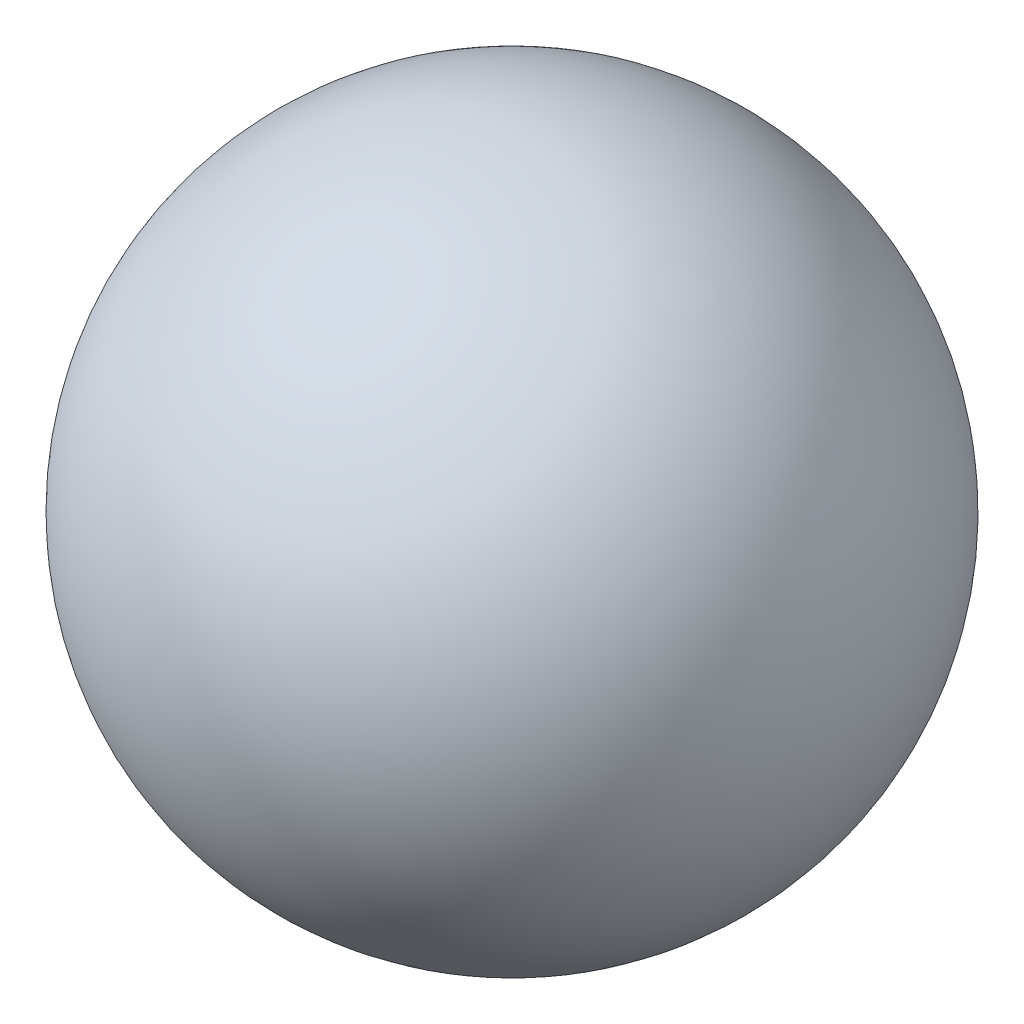
ISO-10303-21;
HEADER;
FILE_DESCRIPTION(('STEP AP214'),'2;1');
FILE_NAME('part.step','',(''),(''),'','','');
FILE_SCHEMA(('AUTOMOTIVE_DESIGN { 1 0 10303 214 1 1 1 1 }'));
ENDSEC;
DATA;
#1=APPLICATION_CONTEXT('core data for automotive mechanical design processes');
#2=APPLICATION_PROTOCOL_DEFINITION('international standard','automotive_design',2000,#1);
#3=PRODUCT_CONTEXT('',#1,'mechanical');
#4=PRODUCT('Part','Part','',(#3));
#5=PRODUCT_RELATED_PRODUCT_CATEGORY('part','',(#4));
#6=PRODUCT_DEFINITION_FORMATION('','',#4);
#7=PRODUCT_DEFINITION_CONTEXT('part definition',#1,'design');
#8=PRODUCT_DEFINITION('design','',#6,#7);
#9=PRODUCT_DEFINITION_SHAPE('','',#8);
#10=(LENGTH_UNIT() NAMED_UNIT(*) SI_UNIT(.MILLI.,.METRE.));
#11=(NAMED_UNIT(*) PLANE_ANGLE_UNIT() SI_UNIT($,.RADIAN.));
#12=(NAMED_UNIT(*) SI_UNIT($,.STERADIAN.) SOLID_ANGLE_UNIT());
#13=UNCERTAINTY_MEASURE_WITH_UNIT(LENGTH_MEASURE(1.E-05),#10,'distance_accuracy_value','');
#14=(GEOMETRIC_REPRESENTATION_CONTEXT(3) GLOBAL_UNCERTAINTY_ASSIGNED_CONTEXT((#13)) GLOBAL_UNIT_ASSIGNED_CONTEXT((#10,
#11,#12)) REPRESENTATION_CONTEXT('',''));
#15=CARTESIAN_POINT('',(0.,0.,0.));
#16=DIRECTION('',(0.,0.,1.));
#17=DIRECTION('',(1.,0.,0.));
#18=AXIS2_PLACEMENT_3D('',#15,#16,#17);
#19=CARTESIAN_POINT('',(0.,19.05,0.));
#20=DIRECTION('',(0.,1.,0.));
#21=DIRECTION('',(1.,0.,0.));
#22=AXIS2_PLACEMENT_3D('',#19,#20,#21);
#23=SPHERICAL_SURFACE('',#22,19.05);
#24=CARTESIAN_POINT('',(0.,1.0894877578617,0.));
#25=DIRECTION('',(0.,1.,0.));
#26=DIRECTION('',(0.,0.,1.));
#27=AXIS2_PLACEMENT_3D('',#24,#25,#26);
#28=CIRCLE('',#27,6.35);
#29=CARTESIAN_POINT('',(0.,1.0894877578617,-6.35));
#30=VERTEX_POINT('',#29);
#31=EDGE_CURVE('E10',#30,#30,#28,.F.);
#32=ORIENTED_EDGE('',*,*,#31,.F.);
#33=EDGE_LOOP('',(#32));
#34=FACE_BOUND('',#33,.T.);
#35=ADVANCED_FACE('F34',(#34),#23,.T.);
#36=CARTESIAN_POINT('',(0.,19.05,0.));
#37=DIRECTION('',(0.,-1.,0.));
#38=DIRECTION('',(0.,0.,-1.));
#39=AXIS2_PLACEMENT_3D('',#36,#37,#38);
#40=CYLINDRICAL_SURFACE('',#39,6.35);
#41=CARTESIAN_POINT('',(0.,19.05,0.));
#42=DIRECTION('',(0.,1.,0.));
#43=DIRECTION('',(0.,0.,1.));
#44=AXIS2_PLACEMENT_3D('',#41,#42,#43);
#45=CIRCLE('',#44,6.35);
#46=CARTESIAN_POINT('',(0.,19.05,-6.35));
#47=VERTEX_POINT('',#46);
#48=EDGE_CURVE('E40',#47,#47,#45,.T.);
#49=CARTESIAN_POINT('',(0.,19.05,-6.35));
#50=CARTESIAN_POINT('',(0.,18.8629113308111,-6.35));
#51=CARTESIAN_POINT('',(0.,18.6758226616221,-6.35));
#52=CARTESIAN_POINT('',(0.,18.3016453232442,-6.35));
#53=CARTESIAN_POINT('',(0.,18.1145566540553,-6.35));
#54=CARTESIAN_POINT('',(0.,17.7403793156774,-6.35));
#55=CARTESIAN_POINT('',(0.,17.5532906464885,-6.35));
#56=CARTESIAN_POINT('',(0.,17.1791133081106,-6.35));
#57=CARTESIAN_POINT('',(0.,16.9920246389217,-6.35));
#58=CARTESIAN_POINT('',(0.,16.6178473005438,-6.35));
#59=CARTESIAN_POINT('',(0.,16.4307586313548,-6.35));
#60=CARTESIAN_POINT('',(0.,16.0565812929769,-6.35));
#61=CARTESIAN_POINT('',(0.,15.869492623788,-6.35));
#62=CARTESIAN_POINT('',(0.,15.4953152854101,-6.35));
#63=CARTESIAN_POINT('',(0.,15.3082266162212,-6.35));
#64=CARTESIAN_POINT('',(0.,14.9340492778433,-6.35));
#65=CARTESIAN_POINT('',(0.,14.7469606086544,-6.35));
#66=CARTESIAN_POINT('',(0.,14.3727832702765,-6.35));
#67=CARTESIAN_POINT('',(0.,14.1856946010875,-6.35));
#68=CARTESIAN_POINT('',(0.,13.8115172627097,-6.35));
#69=CARTESIAN_POINT('',(0.,13.6244285935207,-6.35));
#70=CARTESIAN_POINT('',(0.,13.2502512551428,-6.35));
#71=CARTESIAN_POINT('',(0.,13.0631625859539,-6.35));
#72=CARTESIAN_POINT('',(0.,12.688985247576,-6.35));
#73=CARTESIAN_POINT('',(0.,12.5018965783871,-6.35));
#74=CARTESIAN_POINT('',(0.,12.1277192400092,-6.35));
#75=CARTESIAN_POINT('',(0.,11.9406305708203,-6.35));
#76=CARTESIAN_POINT('',(0.,11.5664532324424,-6.35));
#77=CARTESIAN_POINT('',(0.,11.3793645632534,-6.35));
#78=CARTESIAN_POINT('',(0.,11.0051872248756,-6.35));
#79=CARTESIAN_POINT('',(0.,10.8180985556866,-6.35));
#80=CARTESIAN_POINT('',(0.,10.4439212173087,-6.35));
#81=CARTESIAN_POINT('',(0.,10.2568325481198,-6.35));
#82=CARTESIAN_POINT('',(0.,9.88265520974191,-6.35));
#83=CARTESIAN_POINT('',(0.,9.69556654055297,-6.35));
#84=CARTESIAN_POINT('',(0.,9.32138920217509,-6.35));
#85=CARTESIAN_POINT('',(0.,9.13430053298615,-6.35));
#86=CARTESIAN_POINT('',(0.,8.76012319460827,-6.35));
#87=CARTESIAN_POINT('',(0.,8.57303452541932,-6.35));
#88=CARTESIAN_POINT('',(0.,8.19885718704144,-6.35));
#89=CARTESIAN_POINT('',(0.,8.0117685178525,-6.35));
#90=CARTESIAN_POINT('',(0.,7.63759117947462,-6.35));
#91=CARTESIAN_POINT('',(0.,7.45050251028568,-6.35));
#92=CARTESIAN_POINT('',(0.,7.0763251719078,-6.35));
#93=CARTESIAN_POINT('',(0.,6.88923650271886,-6.35));
#94=CARTESIAN_POINT('',(0.,6.51505916434098,-6.35));
#95=CARTESIAN_POINT('',(0.,6.32797049515204,-6.35));
#96=CARTESIAN_POINT('',(0.,5.95379315677415,-6.35));
#97=CARTESIAN_POINT('',(0.,5.76670448758521,-6.35));
#98=CARTESIAN_POINT('',(0.,5.39252714920733,-6.35));
#99=CARTESIAN_POINT('',(0.,5.20543848001839,-6.35));
#100=CARTESIAN_POINT('',(0.,4.83126114164051,-6.35));
#101=CARTESIAN_POINT('',(0.,4.64417247245157,-6.35));
#102=CARTESIAN_POINT('',(0.,4.26999513407369,-6.35));
#103=CARTESIAN_POINT('',(0.,4.08290646488475,-6.35));
#104=CARTESIAN_POINT('',(0.,3.70872912650687,-6.35));
#105=CARTESIAN_POINT('',(0.,3.52164045731792,-6.35));
#106=CARTESIAN_POINT('',(0.,3.14746311894004,-6.35));
#107=CARTESIAN_POINT('',(0.,2.9603744497511,-6.35));
#108=CARTESIAN_POINT('',(0.,2.58619711137322,-6.35));
#109=CARTESIAN_POINT('',(0.,2.39910844218428,-6.35));
#110=CARTESIAN_POINT('',(0.,2.0249311038064,-6.35));
#111=CARTESIAN_POINT('',(0.,1.83784243461746,-6.35));
#112=CARTESIAN_POINT('',(0.,1.46366509623958,-6.35));
#113=CARTESIAN_POINT('',(0.,1.27657642705064,-6.35));
#114=CARTESIAN_POINT('',(0.,1.0894877578617,-6.35));
#115=B_SPLINE_CURVE_WITH_KNOTS('',3,(#49,#50,#51,#52,#53,#54,#55,#56,#57,#58,#59,#60,#61,#62,
#63,#64,#65,#66,#67,#68,#69,#70,#71,#72,#73,#74,#75,#76,#77,#78,#79,#80,#81,#82,#83,#84,#85,#86,
#87,#88,#89,#90,#91,#92,#93,#94,#95,#96,#97,#98,#99,#100,#101,#102,#103,#104,#105,#106,#107,
#108,#109,#110,#111,#112,#113,#114),.UNSPECIFIED.,.F.,.F.,(4,2,2,2,2,2,2,2,2,2,2,2,2,2,2,2,2,2,
2,2,2,2,2,2,2,2,2,2,2,2,2,2,4),(0.,0.56126600756682,1.12253201513364,1.68379802270046,
2.24506403026729,2.80633003783411,3.36759604540093,3.92886205296775,4.49012806053457,
5.05139406810139,5.61266007566822,6.17392608323504,6.73519209080186,7.29645809836868,
7.8577241059355,8.41899011350233,8.98025612106915,9.54152212863597,10.1027881362028,
10.6640541437696,11.2253201513364,11.7865861589033,12.3478521664701,12.9091181740369,
13.4703841816037,14.0316501891705,14.5929161967374,15.1541822043042,15.715448211871,
16.2767142194378,16.8379802270047,17.3992462345715,17.9605122421383),.UNSPECIFIED.);
#116=EDGE_CURVE('BSEAM46',#47,#30,#115,.T.);
#117=ORIENTED_EDGE('',*,*,#48,.T.);
#118=ORIENTED_EDGE('',*,*,#31,.T.);
#119=ORIENTED_EDGE('',*,*,#116,.T.);
#120=ORIENTED_EDGE('',*,*,#116,.F.);
#121=EDGE_LOOP('',(#117,#119,#118,#120));
#122=FACE_BOUND('',#121,.T.);
#123=ADVANCED_FACE('F46',(#122),#40,.F.);
#124=CARTESIAN_POINT('',(0.,19.05,0.));
#125=DIRECTION('',(0.,1.,0.));
#126=DIRECTION('',(0.,0.,1.));
#127=AXIS2_PLACEMENT_3D('',#124,#125,#126);
#128=PLANE('',#127);
#129=ORIENTED_EDGE('',*,*,#48,.F.);
#130=EDGE_LOOP('',(#129));
#131=FACE_BOUND('',#130,.T.);
#132=ADVANCED_FACE('F48',(#131),#128,.F.);
#133=CLOSED_SHELL('',(#35,#123,#132));
#134=MANIFOLD_SOLID_BREP('B2',#133);
#135=ADVANCED_BREP_SHAPE_REPRESENTATION('',(#18,#134),#14);
#136=SHAPE_DEFINITION_REPRESENTATION(#9,#135);
ENDSEC;
END-ISO-10303-21;
